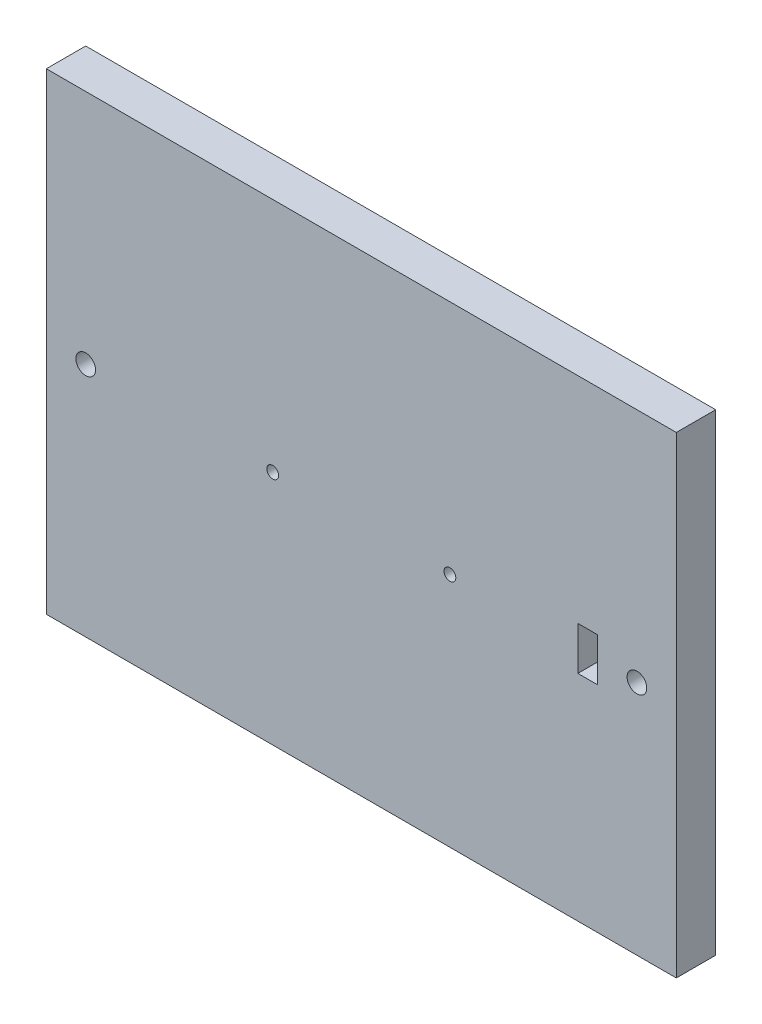
ISO-10303-21;
HEADER;
FILE_DESCRIPTION(('STEP AP214'),'2;1');
FILE_NAME('part.step','',(''),(''),'','','');
FILE_SCHEMA(('AUTOMOTIVE_DESIGN { 1 0 10303 214 1 1 1 1 }'));
ENDSEC;
DATA;
#1=APPLICATION_CONTEXT('core data for automotive mechanical design processes');
#2=APPLICATION_PROTOCOL_DEFINITION('international standard','automotive_design',2000,#1);
#3=PRODUCT_CONTEXT('',#1,'mechanical');
#4=PRODUCT('Part','Part','',(#3));
#5=PRODUCT_RELATED_PRODUCT_CATEGORY('part','',(#4));
#6=PRODUCT_DEFINITION_FORMATION('','',#4);
#7=PRODUCT_DEFINITION_CONTEXT('part definition',#1,'design');
#8=PRODUCT_DEFINITION('design','',#6,#7);
#9=PRODUCT_DEFINITION_SHAPE('','',#8);
#10=(LENGTH_UNIT() NAMED_UNIT(*) SI_UNIT(.MILLI.,.METRE.));
#11=(NAMED_UNIT(*) PLANE_ANGLE_UNIT() SI_UNIT($,.RADIAN.));
#12=(NAMED_UNIT(*) SI_UNIT($,.STERADIAN.) SOLID_ANGLE_UNIT());
#13=UNCERTAINTY_MEASURE_WITH_UNIT(LENGTH_MEASURE(1.E-05),#10,'distance_accuracy_value','');
#14=(GEOMETRIC_REPRESENTATION_CONTEXT(3) GLOBAL_UNCERTAINTY_ASSIGNED_CONTEXT((#13)) GLOBAL_UNIT_ASSIGNED_CONTEXT((#10,
#11,#12)) REPRESENTATION_CONTEXT('',''));
#15=CARTESIAN_POINT('',(0.,0.,0.));
#16=DIRECTION('',(0.,0.,1.));
#17=DIRECTION('',(1.,0.,0.));
#18=AXIS2_PLACEMENT_3D('',#15,#16,#17);
#19=CARTESIAN_POINT('',(0.,0.,0.));
#20=DIRECTION('',(0.,0.,1.));
#21=DIRECTION('',(1.,0.,0.));
#22=AXIS2_PLACEMENT_3D('',#19,#20,#21);
#23=PLANE('',#22);
#24=DIRECTION('',(1.,0.,0.));
#25=VECTOR('',#24,1.);
#26=CARTESIAN_POINT('',(-80.,-60.,0.));
#27=LINE('',#26,#25);
#28=CARTESIAN_POINT('',(-80.,-60.,0.));
#29=VERTEX_POINT('',#28);
#30=CARTESIAN_POINT('',(80.,-60.,0.));
#31=VERTEX_POINT('',#30);
#32=EDGE_CURVE('E436',#29,#31,#27,.T.);
#33=ORIENTED_EDGE('',*,*,#32,.F.);
#34=DIRECTION('',(0.,1.,0.));
#35=VECTOR('',#34,1.);
#36=CARTESIAN_POINT('',(-80.,-60.,0.));
#37=LINE('',#36,#35);
#38=CARTESIAN_POINT('',(-80.,60.,0.));
#39=VERTEX_POINT('',#38);
#40=EDGE_CURVE('E445',#29,#39,#37,.T.);
#41=ORIENTED_EDGE('',*,*,#40,.T.);
#42=DIRECTION('',(1.,0.,0.));
#43=VECTOR('',#42,1.);
#44=CARTESIAN_POINT('',(-80.,60.,0.));
#45=LINE('',#44,#43);
#46=CARTESIAN_POINT('',(80.,60.,0.));
#47=VERTEX_POINT('',#46);
#48=EDGE_CURVE('E464',#39,#47,#45,.T.);
#49=ORIENTED_EDGE('',*,*,#48,.T.);
#50=DIRECTION('',(0.,1.,0.));
#51=VECTOR('',#50,1.);
#52=CARTESIAN_POINT('',(80.,-60.,0.));
#53=LINE('',#52,#51);
#54=EDGE_CURVE('E460',#31,#47,#53,.T.);
#55=ORIENTED_EDGE('',*,*,#54,.F.);
#56=EDGE_LOOP('',(#33,#41,#49,#55));
#57=FACE_BOUND('',#56,.T.);
#58=CARTESIAN_POINT('',(22.5,0.,0.));
#59=DIRECTION('',(0.,0.,-1.));
#60=DIRECTION('',(-1.,0.,0.));
#61=AXIS2_PLACEMENT_3D('',#58,#59,#60);
#62=CIRCLE('',#61,1.5);
#63=CARTESIAN_POINT('',(21.,0.,0.));
#64=VERTEX_POINT('',#63);
#65=EDGE_CURVE('E374',#64,#64,#62,.T.);
#66=ORIENTED_EDGE('',*,*,#65,.F.);
#67=EDGE_LOOP('',(#66));
#68=FACE_BOUND('',#67,.T.);
#69=CARTESIAN_POINT('',(-22.5,0.,0.));
#70=DIRECTION('',(0.,0.,-1.));
#71=DIRECTION('',(-1.,0.,0.));
#72=AXIS2_PLACEMENT_3D('',#69,#70,#71);
#73=CIRCLE('',#72,1.5);
#74=CARTESIAN_POINT('',(-24.,0.,0.));
#75=VERTEX_POINT('',#74);
#76=EDGE_CURVE('E375',#75,#75,#73,.T.);
#77=ORIENTED_EDGE('',*,*,#76,.F.);
#78=EDGE_LOOP('',(#77));
#79=FACE_BOUND('',#78,.T.);
#80=DIRECTION('',(-1.,0.,0.));
#81=VECTOR('',#80,1.);
#82=CARTESIAN_POINT('',(55.,-5.5,0.));
#83=LINE('',#82,#81);
#84=CARTESIAN_POINT('',(60.,-5.50000000000001,0.));
#85=VERTEX_POINT('',#84);
#86=CARTESIAN_POINT('',(55.,-5.5,0.));
#87=VERTEX_POINT('',#86);
#88=EDGE_CURVE('E409',#85,#87,#83,.T.);
#89=ORIENTED_EDGE('',*,*,#88,.F.);
#90=DIRECTION('',(0.,-1.,0.));
#91=VECTOR('',#90,1.);
#92=CARTESIAN_POINT('',(60.,-5.50000000000001,0.));
#93=LINE('',#92,#91);
#94=CARTESIAN_POINT('',(60.,5.49999999999999,0.));
#95=VERTEX_POINT('',#94);
#96=EDGE_CURVE('E406',#95,#85,#93,.T.);
#97=ORIENTED_EDGE('',*,*,#96,.F.);
#98=DIRECTION('',(1.,0.,0.));
#99=VECTOR('',#98,1.);
#100=CARTESIAN_POINT('',(55.,5.49999999999999,0.));
#101=LINE('',#100,#99);
#102=CARTESIAN_POINT('',(55.,5.49999999999999,0.));
#103=VERTEX_POINT('',#102);
#104=EDGE_CURVE('E393',#103,#95,#101,.T.);
#105=ORIENTED_EDGE('',*,*,#104,.F.);
#106=DIRECTION('',(0.,1.,0.));
#107=VECTOR('',#106,1.);
#108=CARTESIAN_POINT('',(55.,-5.5,0.));
#109=LINE('',#108,#107);
#110=EDGE_CURVE('E414',#87,#103,#109,.T.);
#111=ORIENTED_EDGE('',*,*,#110,.F.);
#112=EDGE_LOOP('',(#89,#97,#105,#111));
#113=FACE_BOUND('',#112,.T.);
#114=DIRECTION('',(-1.,0.,0.));
#115=VECTOR('',#114,1.);
#116=CARTESIAN_POINT('',(-75.,-5.,0.));
#117=LINE('',#116,#115);
#118=CARTESIAN_POINT('',(-65.,-5.,0.));
#119=VERTEX_POINT('',#118);
#120=CARTESIAN_POINT('',(-75.,-5.,0.));
#121=VERTEX_POINT('',#120);
#122=EDGE_CURVE('E348',#119,#121,#117,.T.);
#123=ORIENTED_EDGE('',*,*,#122,.F.);
#124=DIRECTION('',(0.,-1.,0.));
#125=VECTOR('',#124,1.);
#126=CARTESIAN_POINT('',(-65.,-5.,0.));
#127=LINE('',#126,#125);
#128=CARTESIAN_POINT('',(-65.,5.,0.));
#129=VERTEX_POINT('',#128);
#130=EDGE_CURVE('E281',#129,#119,#127,.T.);
#131=ORIENTED_EDGE('',*,*,#130,.F.);
#132=DIRECTION('',(1.,0.,0.));
#133=VECTOR('',#132,1.);
#134=CARTESIAN_POINT('',(-75.,5.,0.));
#135=LINE('',#134,#133);
#136=CARTESIAN_POINT('',(-75.,5.,0.));
#137=VERTEX_POINT('',#136);
#138=EDGE_CURVE('E333',#137,#129,#135,.T.);
#139=ORIENTED_EDGE('',*,*,#138,.F.);
#140=DIRECTION('',(0.,1.,0.));
#141=VECTOR('',#140,1.);
#142=CARTESIAN_POINT('',(-75.,-5.,0.));
#143=LINE('',#142,#141);
#144=EDGE_CURVE('E352',#121,#137,#143,.T.);
#145=ORIENTED_EDGE('',*,*,#144,.F.);
#146=EDGE_LOOP('',(#123,#131,#139,#145));
#147=FACE_BOUND('',#146,.T.);
#148=DIRECTION('',(-1.,0.,0.));
#149=VECTOR('',#148,1.);
#150=CARTESIAN_POINT('',(65.,-5.,0.));
#151=LINE('',#150,#149);
#152=CARTESIAN_POINT('',(75.,-5.,0.));
#153=VERTEX_POINT('',#152);
#154=CARTESIAN_POINT('',(65.,-5.,0.));
#155=VERTEX_POINT('',#154);
#156=EDGE_CURVE('E303',#153,#155,#151,.T.);
#157=ORIENTED_EDGE('',*,*,#156,.F.);
#158=DIRECTION('',(0.,-1.,0.));
#159=VECTOR('',#158,1.);
#160=CARTESIAN_POINT('',(75.,-5.,0.));
#161=LINE('',#160,#159);
#162=CARTESIAN_POINT('',(75.,5.,0.));
#163=VERTEX_POINT('',#162);
#164=EDGE_CURVE('E300',#163,#153,#161,.T.);
#165=ORIENTED_EDGE('',*,*,#164,.F.);
#166=DIRECTION('',(1.,0.,0.));
#167=VECTOR('',#166,1.);
#168=CARTESIAN_POINT('',(65.,5.,0.));
#169=LINE('',#168,#167);
#170=CARTESIAN_POINT('',(65.,5.,0.));
#171=VERTEX_POINT('',#170);
#172=EDGE_CURVE('E287',#171,#163,#169,.T.);
#173=ORIENTED_EDGE('',*,*,#172,.F.);
#174=DIRECTION('',(0.,1.,0.));
#175=VECTOR('',#174,1.);
#176=CARTESIAN_POINT('',(65.,-5.,0.));
#177=LINE('',#176,#175);
#178=EDGE_CURVE('E308',#155,#171,#177,.T.);
#179=ORIENTED_EDGE('',*,*,#178,.F.);
#180=EDGE_LOOP('',(#157,#165,#173,#179));
#181=FACE_BOUND('',#180,.T.);
#182=DIRECTION('',(0.,-1.,0.));
#183=VECTOR('',#182,1.);
#184=CARTESIAN_POINT('',(45.,-14.,0.));
#185=LINE('',#184,#183);
#186=CARTESIAN_POINT('',(45.,-11.,0.));
#187=VERTEX_POINT('',#186);
#188=CARTESIAN_POINT('',(45.,-14.,0.));
#189=VERTEX_POINT('',#188);
#190=EDGE_CURVE('E232',#187,#189,#185,.T.);
#191=ORIENTED_EDGE('',*,*,#190,.F.);
#192=DIRECTION('',(1.,0.,0.));
#193=VECTOR('',#192,1.);
#194=CARTESIAN_POINT('',(-45.,-11.,0.));
#195=LINE('',#194,#193);
#196=CARTESIAN_POINT('',(-45.,-11.,0.));
#197=VERTEX_POINT('',#196);
#198=EDGE_CURVE('E242',#197,#187,#195,.T.);
#199=ORIENTED_EDGE('',*,*,#198,.F.);
#200=DIRECTION('',(0.,1.,0.));
#201=VECTOR('',#200,1.);
#202=CARTESIAN_POINT('',(-45.,-14.,0.));
#203=LINE('',#202,#201);
#204=CARTESIAN_POINT('',(-45.,-14.,0.));
#205=VERTEX_POINT('',#204);
#206=EDGE_CURVE('E259',#205,#197,#203,.T.);
#207=ORIENTED_EDGE('',*,*,#206,.F.);
#208=DIRECTION('',(-1.,0.,0.));
#209=VECTOR('',#208,1.);
#210=CARTESIAN_POINT('',(-45.,-14.,0.));
#211=LINE('',#210,#209);
#212=EDGE_CURVE('E255',#189,#205,#211,.T.);
#213=ORIENTED_EDGE('',*,*,#212,.F.);
#214=EDGE_LOOP('',(#191,#199,#207,#213));
#215=FACE_BOUND('',#214,.T.);
#216=ADVANCED_FACE('F39',(#57,#68,#79,#113,#147,#181,#215),#23,.F.);
#217=CARTESIAN_POINT('',(-70.,0.,10.));
#218=DIRECTION('',(0.,0.,-1.));
#219=DIRECTION('',(-1.,0.,0.));
#220=AXIS2_PLACEMENT_3D('',#217,#218,#219);
#221=CYLINDRICAL_SURFACE('',#220,2.5);
#222=CARTESIAN_POINT('',(-70.,0.,10.));
#223=DIRECTION('',(0.,0.,-1.));
#224=DIRECTION('',(-1.,0.,0.));
#225=AXIS2_PLACEMENT_3D('',#222,#223,#224);
#226=CIRCLE('',#225,2.5);
#227=CARTESIAN_POINT('',(-72.5,0.,10.));
#228=VERTEX_POINT('',#227);
#229=EDGE_CURVE('E379',#228,#228,#226,.T.);
#230=ORIENTED_EDGE('',*,*,#229,.F.);
#231=EDGE_LOOP('',(#230));
#232=FACE_BOUND('',#231,.T.);
#233=CARTESIAN_POINT('',(-70.,0.,4.));
#234=DIRECTION('',(0.,0.,-1.));
#235=DIRECTION('',(-1.,0.,0.));
#236=AXIS2_PLACEMENT_3D('',#233,#234,#235);
#237=CIRCLE('',#236,2.5);
#238=CARTESIAN_POINT('',(-72.5,0.,4.));
#239=VERTEX_POINT('',#238);
#240=EDGE_CURVE('E410',#239,#239,#237,.F.);
#241=ORIENTED_EDGE('',*,*,#240,.F.);
#242=EDGE_LOOP('',(#241));
#243=FACE_BOUND('',#242,.T.);
#244=ADVANCED_FACE('F514',(#232,#243),#221,.F.);
#245=CARTESIAN_POINT('',(70.,0.,10.));
#246=DIRECTION('',(0.,0.,-1.));
#247=DIRECTION('',(-1.,0.,0.));
#248=AXIS2_PLACEMENT_3D('',#245,#246,#247);
#249=CYLINDRICAL_SURFACE('',#248,2.5);
#250=CARTESIAN_POINT('',(70.,0.,10.));
#251=DIRECTION('',(0.,0.,-1.));
#252=DIRECTION('',(-1.,0.,0.));
#253=AXIS2_PLACEMENT_3D('',#250,#251,#252);
#254=CIRCLE('',#253,2.5);
#255=CARTESIAN_POINT('',(67.5,0.,10.));
#256=VERTEX_POINT('',#255);
#257=EDGE_CURVE('E383',#256,#256,#254,.T.);
#258=ORIENTED_EDGE('',*,*,#257,.F.);
#259=EDGE_LOOP('',(#258));
#260=FACE_BOUND('',#259,.T.);
#261=CARTESIAN_POINT('',(70.,0.,4.));
#262=DIRECTION('',(0.,0.,-1.));
#263=DIRECTION('',(-1.,0.,0.));
#264=AXIS2_PLACEMENT_3D('',#261,#262,#263);
#265=CIRCLE('',#264,2.5);
#266=CARTESIAN_POINT('',(67.5,0.,4.));
#267=VERTEX_POINT('',#266);
#268=EDGE_CURVE('E318',#267,#267,#265,.F.);
#269=ORIENTED_EDGE('',*,*,#268,.F.);
#270=EDGE_LOOP('',(#269));
#271=FACE_BOUND('',#270,.T.);
#272=ADVANCED_FACE('F520',(#260,#271),#249,.F.);
#273=CARTESIAN_POINT('',(-80.,-60.,10.));
#274=DIRECTION('',(0.,1.,0.));
#275=DIRECTION('',(0.,0.,1.));
#276=AXIS2_PLACEMENT_3D('',#273,#274,#275);
#277=PLANE('',#276);
#278=ORIENTED_EDGE('',*,*,#32,.T.);
#279=DIRECTION('',(0.,0.,-1.));
#280=VECTOR('',#279,1.);
#281=CARTESIAN_POINT('',(80.,-60.,10.));
#282=LINE('',#281,#280);
#283=CARTESIAN_POINT('',(80.,-60.,10.));
#284=VERTEX_POINT('',#283);
#285=EDGE_CURVE('E479',#284,#31,#282,.T.);
#286=ORIENTED_EDGE('',*,*,#285,.F.);
#287=DIRECTION('',(1.,0.,0.));
#288=VECTOR('',#287,1.);
#289=CARTESIAN_POINT('',(-80.,-60.,10.));
#290=LINE('',#289,#288);
#291=CARTESIAN_POINT('',(-80.,-60.,10.));
#292=VERTEX_POINT('',#291);
#293=EDGE_CURVE('E440',#292,#284,#290,.T.);
#294=ORIENTED_EDGE('',*,*,#293,.F.);
#295=DIRECTION('',(0.,0.,-1.));
#296=VECTOR('',#295,1.);
#297=CARTESIAN_POINT('',(-80.,-60.,10.));
#298=LINE('',#297,#296);
#299=EDGE_CURVE('E456',#292,#29,#298,.T.);
#300=ORIENTED_EDGE('',*,*,#299,.T.);
#301=EDGE_LOOP('',(#278,#286,#294,#300));
#302=FACE_BOUND('',#301,.T.);
#303=ADVANCED_FACE('F41',(#302),#277,.F.);
#304=CARTESIAN_POINT('',(80.,-60.,10.));
#305=DIRECTION('',(-1.,0.,0.));
#306=DIRECTION('',(0.,0.,1.));
#307=AXIS2_PLACEMENT_3D('',#304,#305,#306);
#308=PLANE('',#307);
#309=ORIENTED_EDGE('',*,*,#54,.T.);
#310=DIRECTION('',(0.,0.,-1.));
#311=VECTOR('',#310,1.);
#312=CARTESIAN_POINT('',(80.,60.,10.));
#313=LINE('',#312,#311);
#314=CARTESIAN_POINT('',(80.,60.,10.));
#315=VERTEX_POINT('',#314);
#316=EDGE_CURVE('E476',#315,#47,#313,.T.);
#317=ORIENTED_EDGE('',*,*,#316,.F.);
#318=DIRECTION('',(0.,1.,0.));
#319=VECTOR('',#318,1.);
#320=CARTESIAN_POINT('',(80.,-60.,10.));
#321=LINE('',#320,#319);
#322=EDGE_CURVE('E444',#284,#315,#321,.T.);
#323=ORIENTED_EDGE('',*,*,#322,.F.);
#324=ORIENTED_EDGE('',*,*,#285,.T.);
#325=EDGE_LOOP('',(#309,#317,#323,#324));
#326=FACE_BOUND('',#325,.T.);
#327=ADVANCED_FACE('F535',(#326),#308,.F.);
#328=CARTESIAN_POINT('',(-80.,60.,10.));
#329=DIRECTION('',(0.,1.,0.));
#330=DIRECTION('',(0.,0.,1.));
#331=AXIS2_PLACEMENT_3D('',#328,#329,#330);
#332=PLANE('',#331);
#333=ORIENTED_EDGE('',*,*,#48,.F.);
#334=DIRECTION('',(0.,0.,-1.));
#335=VECTOR('',#334,1.);
#336=CARTESIAN_POINT('',(-80.,60.,10.));
#337=LINE('',#336,#335);
#338=CARTESIAN_POINT('',(-80.,60.,10.));
#339=VERTEX_POINT('',#338);
#340=EDGE_CURVE('E473',#339,#39,#337,.T.);
#341=ORIENTED_EDGE('',*,*,#340,.F.);
#342=DIRECTION('',(1.,0.,0.));
#343=VECTOR('',#342,1.);
#344=CARTESIAN_POINT('',(-80.,60.,10.));
#345=LINE('',#344,#343);
#346=EDGE_CURVE('E448',#339,#315,#345,.T.);
#347=ORIENTED_EDGE('',*,*,#346,.T.);
#348=ORIENTED_EDGE('',*,*,#316,.T.);
#349=EDGE_LOOP('',(#333,#341,#347,#348));
#350=FACE_BOUND('',#349,.T.);
#351=ADVANCED_FACE('F532',(#350),#332,.T.);
#352=CARTESIAN_POINT('',(-80.,-60.,10.));
#353=DIRECTION('',(-1.,0.,0.));
#354=DIRECTION('',(0.,0.,1.));
#355=AXIS2_PLACEMENT_3D('',#352,#353,#354);
#356=PLANE('',#355);
#357=ORIENTED_EDGE('',*,*,#40,.F.);
#358=ORIENTED_EDGE('',*,*,#299,.F.);
#359=DIRECTION('',(0.,1.,0.));
#360=VECTOR('',#359,1.);
#361=CARTESIAN_POINT('',(-80.,-60.,10.));
#362=LINE('',#361,#360);
#363=EDGE_CURVE('E452',#292,#339,#362,.T.);
#364=ORIENTED_EDGE('',*,*,#363,.T.);
#365=ORIENTED_EDGE('',*,*,#340,.T.);
#366=EDGE_LOOP('',(#357,#358,#364,#365));
#367=FACE_BOUND('',#366,.T.);
#368=ADVANCED_FACE('F529',(#367),#356,.T.);
#369=CARTESIAN_POINT('',(0.,0.,10.));
#370=DIRECTION('',(0.,0.,1.));
#371=DIRECTION('',(1.,0.,0.));
#372=AXIS2_PLACEMENT_3D('',#369,#370,#371);
#373=PLANE('',#372);
#374=DIRECTION('',(0.,-1.,0.));
#375=VECTOR('',#374,1.);
#376=CARTESIAN_POINT('',(60.,-5.50000000000001,10.));
#377=LINE('',#376,#375);
#378=CARTESIAN_POINT('',(60.,5.49999999999999,10.));
#379=VERTEX_POINT('',#378);
#380=CARTESIAN_POINT('',(60.,-5.50000000000001,10.));
#381=VERTEX_POINT('',#380);
#382=EDGE_CURVE('E388',#379,#381,#377,.T.);
#383=ORIENTED_EDGE('',*,*,#382,.T.);
#384=DIRECTION('',(-1.,0.,0.));
#385=VECTOR('',#384,1.);
#386=CARTESIAN_POINT('',(55.,-5.5,10.));
#387=LINE('',#386,#385);
#388=CARTESIAN_POINT('',(55.,-5.5,10.));
#389=VERTEX_POINT('',#388);
#390=EDGE_CURVE('E392',#381,#389,#387,.T.);
#391=ORIENTED_EDGE('',*,*,#390,.T.);
#392=DIRECTION('',(0.,1.,0.));
#393=VECTOR('',#392,1.);
#394=CARTESIAN_POINT('',(55.,-5.5,10.));
#395=LINE('',#394,#393);
#396=CARTESIAN_POINT('',(55.,5.49999999999999,10.));
#397=VERTEX_POINT('',#396);
#398=EDGE_CURVE('E397',#389,#397,#395,.T.);
#399=ORIENTED_EDGE('',*,*,#398,.T.);
#400=DIRECTION('',(1.,0.,0.));
#401=VECTOR('',#400,1.);
#402=CARTESIAN_POINT('',(55.,5.49999999999999,10.));
#403=LINE('',#402,#401);
#404=EDGE_CURVE('E401',#397,#379,#403,.T.);
#405=ORIENTED_EDGE('',*,*,#404,.T.);
#406=EDGE_LOOP('',(#383,#391,#399,#405));
#407=FACE_BOUND('',#406,.T.);
#408=ORIENTED_EDGE('',*,*,#257,.T.);
#409=EDGE_LOOP('',(#408));
#410=FACE_BOUND('',#409,.T.);
#411=ORIENTED_EDGE('',*,*,#229,.T.);
#412=EDGE_LOOP('',(#411));
#413=FACE_BOUND('',#412,.T.);
#414=CARTESIAN_POINT('',(-22.5,0.,10.));
#415=DIRECTION('',(0.,0.,-1.));
#416=DIRECTION('',(-1.,0.,0.));
#417=AXIS2_PLACEMENT_3D('',#414,#415,#416);
#418=CIRCLE('',#417,1.5);
#419=CARTESIAN_POINT('',(-24.,0.,10.));
#420=VERTEX_POINT('',#419);
#421=EDGE_CURVE('E370',#420,#420,#418,.T.);
#422=ORIENTED_EDGE('',*,*,#421,.T.);
#423=EDGE_LOOP('',(#422));
#424=FACE_BOUND('',#423,.T.);
#425=CARTESIAN_POINT('',(22.5,0.,10.));
#426=DIRECTION('',(0.,0.,-1.));
#427=DIRECTION('',(-1.,0.,0.));
#428=AXIS2_PLACEMENT_3D('',#425,#426,#427);
#429=CIRCLE('',#428,1.5);
#430=CARTESIAN_POINT('',(21.,0.,10.));
#431=VERTEX_POINT('',#430);
#432=EDGE_CURVE('E432',#431,#431,#429,.T.);
#433=ORIENTED_EDGE('',*,*,#432,.T.);
#434=EDGE_LOOP('',(#433));
#435=FACE_BOUND('',#434,.T.);
#436=ORIENTED_EDGE('',*,*,#293,.T.);
#437=ORIENTED_EDGE('',*,*,#322,.T.);
#438=ORIENTED_EDGE('',*,*,#346,.F.);
#439=ORIENTED_EDGE('',*,*,#363,.F.);
#440=EDGE_LOOP('',(#436,#437,#438,#439));
#441=FACE_BOUND('',#440,.T.);
#442=ADVANCED_FACE('F527',(#407,#410,#413,#424,#435,#441),#373,.T.);
#443=CARTESIAN_POINT('',(22.5,0.,10.));
#444=DIRECTION('',(0.,0.,-1.));
#445=DIRECTION('',(-1.,0.,0.));
#446=AXIS2_PLACEMENT_3D('',#443,#444,#445);
#447=CYLINDRICAL_SURFACE('',#446,1.5);
#448=ORIENTED_EDGE('',*,*,#432,.F.);
#449=EDGE_LOOP('',(#448));
#450=FACE_BOUND('',#449,.T.);
#451=ORIENTED_EDGE('',*,*,#65,.T.);
#452=EDGE_LOOP('',(#451));
#453=FACE_BOUND('',#452,.T.);
#454=ADVANCED_FACE('F552',(#450,#453),#447,.F.);
#455=CARTESIAN_POINT('',(-22.5,0.,10.));
#456=DIRECTION('',(0.,0.,-1.));
#457=DIRECTION('',(-1.,0.,0.));
#458=AXIS2_PLACEMENT_3D('',#455,#456,#457);
#459=CYLINDRICAL_SURFACE('',#458,1.5);
#460=ORIENTED_EDGE('',*,*,#421,.F.);
#461=EDGE_LOOP('',(#460));
#462=FACE_BOUND('',#461,.T.);
#463=ORIENTED_EDGE('',*,*,#76,.T.);
#464=EDGE_LOOP('',(#463));
#465=FACE_BOUND('',#464,.T.);
#466=ADVANCED_FACE('F557',(#462,#465),#459,.F.);
#467=CARTESIAN_POINT('',(60.,-5.50000000000001,10.));
#468=DIRECTION('',(1.,0.,0.));
#469=DIRECTION('',(0.,0.,-1.));
#470=AXIS2_PLACEMENT_3D('',#467,#468,#469);
#471=PLANE('',#470);
#472=ORIENTED_EDGE('',*,*,#96,.T.);
#473=DIRECTION('',(0.,0.,-1.));
#474=VECTOR('',#473,1.);
#475=CARTESIAN_POINT('',(60.,-5.50000000000001,10.));
#476=LINE('',#475,#474);
#477=EDGE_CURVE('E405',#381,#85,#476,.T.);
#478=ORIENTED_EDGE('',*,*,#477,.F.);
#479=ORIENTED_EDGE('',*,*,#382,.F.);
#480=DIRECTION('',(0.,0.,-1.));
#481=VECTOR('',#480,1.);
#482=CARTESIAN_POINT('',(60.,5.49999999999999,10.));
#483=LINE('',#482,#481);
#484=EDGE_CURVE('E387',#379,#95,#483,.T.);
#485=ORIENTED_EDGE('',*,*,#484,.T.);
#486=EDGE_LOOP('',(#472,#478,#479,#485));
#487=FACE_BOUND('',#486,.T.);
#488=ADVANCED_FACE('F648',(#487),#471,.F.);
#489=CARTESIAN_POINT('',(55.,5.49999999999999,10.));
#490=DIRECTION('',(0.,1.,0.));
#491=DIRECTION('',(-1.,0.,0.));
#492=AXIS2_PLACEMENT_3D('',#489,#490,#491);
#493=PLANE('',#492);
#494=ORIENTED_EDGE('',*,*,#104,.T.);
#495=ORIENTED_EDGE('',*,*,#484,.F.);
#496=ORIENTED_EDGE('',*,*,#404,.F.);
#497=DIRECTION('',(0.,0.,-1.));
#498=VECTOR('',#497,1.);
#499=CARTESIAN_POINT('',(55.,5.49999999999999,10.));
#500=LINE('',#499,#498);
#501=EDGE_CURVE('E423',#397,#103,#500,.T.);
#502=ORIENTED_EDGE('',*,*,#501,.T.);
#503=EDGE_LOOP('',(#494,#495,#496,#502));
#504=FACE_BOUND('',#503,.T.);
#505=ADVANCED_FACE('F654',(#504),#493,.F.);
#506=CARTESIAN_POINT('',(55.,-5.5,10.));
#507=DIRECTION('',(-1.,0.,0.));
#508=DIRECTION('',(0.,0.,1.));
#509=AXIS2_PLACEMENT_3D('',#506,#507,#508);
#510=PLANE('',#509);
#511=ORIENTED_EDGE('',*,*,#110,.T.);
#512=ORIENTED_EDGE('',*,*,#501,.F.);
#513=ORIENTED_EDGE('',*,*,#398,.F.);
#514=DIRECTION('',(0.,0.,-1.));
#515=VECTOR('',#514,1.);
#516=CARTESIAN_POINT('',(55.,-5.5,10.));
#517=LINE('',#516,#515);
#518=EDGE_CURVE('E426',#389,#87,#517,.T.);
#519=ORIENTED_EDGE('',*,*,#518,.T.);
#520=EDGE_LOOP('',(#511,#512,#513,#519));
#521=FACE_BOUND('',#520,.T.);
#522=ADVANCED_FACE('F657',(#521),#510,.F.);
#523=CARTESIAN_POINT('',(55.,-5.5,10.));
#524=DIRECTION('',(0.,-1.,0.));
#525=DIRECTION('',(1.,0.,0.));
#526=AXIS2_PLACEMENT_3D('',#523,#524,#525);
#527=PLANE('',#526);
#528=ORIENTED_EDGE('',*,*,#88,.T.);
#529=ORIENTED_EDGE('',*,*,#518,.F.);
#530=ORIENTED_EDGE('',*,*,#390,.F.);
#531=ORIENTED_EDGE('',*,*,#477,.T.);
#532=EDGE_LOOP('',(#528,#529,#530,#531));
#533=FACE_BOUND('',#532,.T.);
#534=ADVANCED_FACE('F611',(#533),#527,.F.);
#535=CARTESIAN_POINT('',(0.,0.,4.));
#536=DIRECTION('',(0.,0.,-1.));
#537=DIRECTION('',(-1.,0.,0.));
#538=AXIS2_PLACEMENT_3D('',#535,#536,#537);
#539=PLANE('',#538);
#540=DIRECTION('',(0.,-1.,0.));
#541=VECTOR('',#540,1.);
#542=CARTESIAN_POINT('',(75.,-5.,4.));
#543=LINE('',#542,#541);
#544=CARTESIAN_POINT('',(75.,5.,4.));
#545=VERTEX_POINT('',#544);
#546=CARTESIAN_POINT('',(75.,-5.,4.));
#547=VERTEX_POINT('',#546);
#548=EDGE_CURVE('E282',#545,#547,#543,.T.);
#549=ORIENTED_EDGE('',*,*,#548,.T.);
#550=DIRECTION('',(-1.,0.,0.));
#551=VECTOR('',#550,1.);
#552=CARTESIAN_POINT('',(65.,-5.,4.));
#553=LINE('',#552,#551);
#554=CARTESIAN_POINT('',(65.,-5.,4.));
#555=VERTEX_POINT('',#554);
#556=EDGE_CURVE('E286',#547,#555,#553,.T.);
#557=ORIENTED_EDGE('',*,*,#556,.T.);
#558=DIRECTION('',(0.,1.,0.));
#559=VECTOR('',#558,1.);
#560=CARTESIAN_POINT('',(65.,-5.,4.));
#561=LINE('',#560,#559);
#562=CARTESIAN_POINT('',(65.,5.,4.));
#563=VERTEX_POINT('',#562);
#564=EDGE_CURVE('E291',#555,#563,#561,.T.);
#565=ORIENTED_EDGE('',*,*,#564,.T.);
#566=DIRECTION('',(1.,0.,0.));
#567=VECTOR('',#566,1.);
#568=CARTESIAN_POINT('',(65.,5.,4.));
#569=LINE('',#568,#567);
#570=EDGE_CURVE('E295',#563,#545,#569,.T.);
#571=ORIENTED_EDGE('',*,*,#570,.T.);
#572=EDGE_LOOP('',(#549,#557,#565,#571));
#573=FACE_BOUND('',#572,.T.);
#574=ORIENTED_EDGE('',*,*,#268,.T.);
#575=EDGE_LOOP('',(#574));
#576=FACE_BOUND('',#575,.T.);
#577=ADVANCED_FACE('F607',(#573,#576),#539,.T.);
#578=CARTESIAN_POINT('',(75.,-5.,4.));
#579=DIRECTION('',(1.,0.,0.));
#580=DIRECTION('',(0.,0.,-1.));
#581=AXIS2_PLACEMENT_3D('',#578,#579,#580);
#582=PLANE('',#581);
#583=ORIENTED_EDGE('',*,*,#164,.T.);
#584=DIRECTION('',(0.,0.,-1.));
#585=VECTOR('',#584,1.);
#586=CARTESIAN_POINT('',(75.,-5.,4.));
#587=LINE('',#586,#585);
#588=EDGE_CURVE('E299',#547,#153,#587,.T.);
#589=ORIENTED_EDGE('',*,*,#588,.F.);
#590=ORIENTED_EDGE('',*,*,#548,.F.);
#591=DIRECTION('',(0.,0.,-1.));
#592=VECTOR('',#591,1.);
#593=CARTESIAN_POINT('',(75.,5.,4.));
#594=LINE('',#593,#592);
#595=EDGE_CURVE('E315',#545,#163,#594,.T.);
#596=ORIENTED_EDGE('',*,*,#595,.T.);
#597=EDGE_LOOP('',(#583,#589,#590,#596));
#598=FACE_BOUND('',#597,.T.);
#599=ADVANCED_FACE('F610',(#598),#582,.F.);
#600=CARTESIAN_POINT('',(65.,5.,4.));
#601=DIRECTION('',(0.,1.,0.));
#602=DIRECTION('',(0.,0.,1.));
#603=AXIS2_PLACEMENT_3D('',#600,#601,#602);
#604=PLANE('',#603);
#605=ORIENTED_EDGE('',*,*,#172,.T.);
#606=ORIENTED_EDGE('',*,*,#595,.F.);
#607=ORIENTED_EDGE('',*,*,#570,.F.);
#608=DIRECTION('',(0.,0.,-1.));
#609=VECTOR('',#608,1.);
#610=CARTESIAN_POINT('',(65.,5.,4.));
#611=LINE('',#610,#609);
#612=EDGE_CURVE('E319',#563,#171,#611,.T.);
#613=ORIENTED_EDGE('',*,*,#612,.T.);
#614=EDGE_LOOP('',(#605,#606,#607,#613));
#615=FACE_BOUND('',#614,.T.);
#616=ADVANCED_FACE('F613',(#615),#604,.F.);
#617=CARTESIAN_POINT('',(65.,-5.,4.));
#618=DIRECTION('',(-1.,0.,0.));
#619=DIRECTION('',(0.,0.,1.));
#620=AXIS2_PLACEMENT_3D('',#617,#618,#619);
#621=PLANE('',#620);
#622=ORIENTED_EDGE('',*,*,#178,.T.);
#623=ORIENTED_EDGE('',*,*,#612,.F.);
#624=ORIENTED_EDGE('',*,*,#564,.F.);
#625=DIRECTION('',(0.,0.,-1.));
#626=VECTOR('',#625,1.);
#627=CARTESIAN_POINT('',(65.,-5.,4.));
#628=LINE('',#627,#626);
#629=EDGE_CURVE('E322',#555,#155,#628,.T.);
#630=ORIENTED_EDGE('',*,*,#629,.T.);
#631=EDGE_LOOP('',(#622,#623,#624,#630));
#632=FACE_BOUND('',#631,.T.);
#633=ADVANCED_FACE('F616',(#632),#621,.F.);
#634=CARTESIAN_POINT('',(65.,-5.,4.));
#635=DIRECTION('',(0.,-1.,0.));
#636=DIRECTION('',(0.,0.,-1.));
#637=AXIS2_PLACEMENT_3D('',#634,#635,#636);
#638=PLANE('',#637);
#639=ORIENTED_EDGE('',*,*,#156,.T.);
#640=ORIENTED_EDGE('',*,*,#629,.F.);
#641=ORIENTED_EDGE('',*,*,#556,.F.);
#642=ORIENTED_EDGE('',*,*,#588,.T.);
#643=EDGE_LOOP('',(#639,#640,#641,#642));
#644=FACE_BOUND('',#643,.T.);
#645=ADVANCED_FACE('F620',(#644),#638,.F.);
#646=CARTESIAN_POINT('',(0.,0.,4.));
#647=DIRECTION('',(0.,0.,-1.));
#648=DIRECTION('',(-1.,0.,0.));
#649=AXIS2_PLACEMENT_3D('',#646,#647,#648);
#650=PLANE('',#649);
#651=DIRECTION('',(0.,-1.,0.));
#652=VECTOR('',#651,1.);
#653=CARTESIAN_POINT('',(-65.,-5.,4.));
#654=LINE('',#653,#652);
#655=CARTESIAN_POINT('',(-65.,5.,4.));
#656=VERTEX_POINT('',#655);
#657=CARTESIAN_POINT('',(-65.,-5.,4.));
#658=VERTEX_POINT('',#657);
#659=EDGE_CURVE('E328',#656,#658,#654,.T.);
#660=ORIENTED_EDGE('',*,*,#659,.T.);
#661=DIRECTION('',(-1.,0.,0.));
#662=VECTOR('',#661,1.);
#663=CARTESIAN_POINT('',(-75.,-5.,4.));
#664=LINE('',#663,#662);
#665=CARTESIAN_POINT('',(-75.,-5.,4.));
#666=VERTEX_POINT('',#665);
#667=EDGE_CURVE('E332',#658,#666,#664,.T.);
#668=ORIENTED_EDGE('',*,*,#667,.T.);
#669=DIRECTION('',(0.,1.,0.));
#670=VECTOR('',#669,1.);
#671=CARTESIAN_POINT('',(-75.,-5.,4.));
#672=LINE('',#671,#670);
#673=CARTESIAN_POINT('',(-75.,5.,4.));
#674=VERTEX_POINT('',#673);
#675=EDGE_CURVE('E337',#666,#674,#672,.T.);
#676=ORIENTED_EDGE('',*,*,#675,.T.);
#677=DIRECTION('',(1.,0.,0.));
#678=VECTOR('',#677,1.);
#679=CARTESIAN_POINT('',(-75.,5.,4.));
#680=LINE('',#679,#678);
#681=EDGE_CURVE('E341',#674,#656,#680,.T.);
#682=ORIENTED_EDGE('',*,*,#681,.T.);
#683=EDGE_LOOP('',(#660,#668,#676,#682));
#684=FACE_BOUND('',#683,.T.);
#685=ORIENTED_EDGE('',*,*,#240,.T.);
#686=EDGE_LOOP('',(#685));
#687=FACE_BOUND('',#686,.T.);
#688=ADVANCED_FACE('F624',(#684,#687),#650,.T.);
#689=CARTESIAN_POINT('',(-65.,-5.,4.));
#690=DIRECTION('',(1.,0.,0.));
#691=DIRECTION('',(0.,0.,-1.));
#692=AXIS2_PLACEMENT_3D('',#689,#690,#691);
#693=PLANE('',#692);
#694=ORIENTED_EDGE('',*,*,#130,.T.);
#695=DIRECTION('',(0.,0.,-1.));
#696=VECTOR('',#695,1.);
#697=CARTESIAN_POINT('',(-65.,-5.,4.));
#698=LINE('',#697,#696);
#699=EDGE_CURVE('E345',#658,#119,#698,.T.);
#700=ORIENTED_EDGE('',*,*,#699,.F.);
#701=ORIENTED_EDGE('',*,*,#659,.F.);
#702=DIRECTION('',(0.,0.,-1.));
#703=VECTOR('',#702,1.);
#704=CARTESIAN_POINT('',(-65.,5.,4.));
#705=LINE('',#704,#703);
#706=EDGE_CURVE('E304',#656,#129,#705,.T.);
#707=ORIENTED_EDGE('',*,*,#706,.T.);
#708=EDGE_LOOP('',(#694,#700,#701,#707));
#709=FACE_BOUND('',#708,.T.);
#710=ADVANCED_FACE('F631',(#709),#693,.F.);
#711=CARTESIAN_POINT('',(-75.,5.,4.));
#712=DIRECTION('',(0.,1.,0.));
#713=DIRECTION('',(0.,0.,1.));
#714=AXIS2_PLACEMENT_3D('',#711,#712,#713);
#715=PLANE('',#714);
#716=ORIENTED_EDGE('',*,*,#138,.T.);
#717=ORIENTED_EDGE('',*,*,#706,.F.);
#718=ORIENTED_EDGE('',*,*,#681,.F.);
#719=DIRECTION('',(0.,0.,-1.));
#720=VECTOR('',#719,1.);
#721=CARTESIAN_POINT('',(-75.,5.,4.));
#722=LINE('',#721,#720);
#723=EDGE_CURVE('E361',#674,#137,#722,.T.);
#724=ORIENTED_EDGE('',*,*,#723,.T.);
#725=EDGE_LOOP('',(#716,#717,#718,#724));
#726=FACE_BOUND('',#725,.T.);
#727=ADVANCED_FACE('F633',(#726),#715,.F.);
#728=CARTESIAN_POINT('',(-75.,-5.,4.));
#729=DIRECTION('',(-1.,0.,0.));
#730=DIRECTION('',(0.,0.,1.));
#731=AXIS2_PLACEMENT_3D('',#728,#729,#730);
#732=PLANE('',#731);
#733=ORIENTED_EDGE('',*,*,#144,.T.);
#734=ORIENTED_EDGE('',*,*,#723,.F.);
#735=ORIENTED_EDGE('',*,*,#675,.F.);
#736=DIRECTION('',(0.,0.,-1.));
#737=VECTOR('',#736,1.);
#738=CARTESIAN_POINT('',(-75.,-5.,4.));
#739=LINE('',#738,#737);
#740=EDGE_CURVE('E364',#666,#121,#739,.T.);
#741=ORIENTED_EDGE('',*,*,#740,.T.);
#742=EDGE_LOOP('',(#733,#734,#735,#741));
#743=FACE_BOUND('',#742,.T.);
#744=ADVANCED_FACE('F636',(#743),#732,.F.);
#745=CARTESIAN_POINT('',(-75.,-5.,4.));
#746=DIRECTION('',(0.,-1.,0.));
#747=DIRECTION('',(0.,0.,-1.));
#748=AXIS2_PLACEMENT_3D('',#745,#746,#747);
#749=PLANE('',#748);
#750=ORIENTED_EDGE('',*,*,#122,.T.);
#751=ORIENTED_EDGE('',*,*,#740,.F.);
#752=ORIENTED_EDGE('',*,*,#667,.F.);
#753=ORIENTED_EDGE('',*,*,#699,.T.);
#754=EDGE_LOOP('',(#750,#751,#752,#753));
#755=FACE_BOUND('',#754,.T.);
#756=ADVANCED_FACE('F603',(#755),#749,.F.);
#757=CARTESIAN_POINT('',(45.,-14.,-25.05));
#758=DIRECTION('',(-1.,0.,0.));
#759=DIRECTION('',(0.,0.,1.));
#760=AXIS2_PLACEMENT_3D('',#757,#758,#759);
#761=PLANE('',#760);
#762=ORIENTED_EDGE('',*,*,#190,.T.);
#763=DIRECTION('',(0.,0.,1.));
#764=VECTOR('',#763,1.);
#765=CARTESIAN_POINT('',(45.,-14.,-25.05));
#766=LINE('',#765,#764);
#767=CARTESIAN_POINT('',(45.,-14.,-25.05));
#768=VERTEX_POINT('',#767);
#769=EDGE_CURVE('E277',#768,#189,#766,.T.);
#770=ORIENTED_EDGE('',*,*,#769,.F.);
#771=DIRECTION('',(0.,-1.,0.));
#772=VECTOR('',#771,1.);
#773=CARTESIAN_POINT('',(45.,-14.,-25.05));
#774=LINE('',#773,#772);
#775=CARTESIAN_POINT('',(45.,-11.,-25.05));
#776=VERTEX_POINT('',#775);
#777=EDGE_CURVE('E237',#776,#768,#774,.T.);
#778=ORIENTED_EDGE('',*,*,#777,.F.);
#779=DIRECTION('',(0.,0.,1.));
#780=VECTOR('',#779,1.);
#781=CARTESIAN_POINT('',(45.,-11.,-25.05));
#782=LINE('',#781,#780);
#783=EDGE_CURVE('E251',#776,#187,#782,.T.);
#784=ORIENTED_EDGE('',*,*,#783,.T.);
#785=EDGE_LOOP('',(#762,#770,#778,#784));
#786=FACE_BOUND('',#785,.T.);
#787=ADVANCED_FACE('F591',(#786),#761,.F.);
#788=CARTESIAN_POINT('',(-45.,-14.,-25.05));
#789=DIRECTION('',(0.,1.,0.));
#790=DIRECTION('',(0.,0.,1.));
#791=AXIS2_PLACEMENT_3D('',#788,#789,#790);
#792=PLANE('',#791);
#793=DIRECTION('',(0.,0.,-1.));
#794=VECTOR('',#793,1.);
#795=CARTESIAN_POINT('',(-3.2,-14.,-19.325));
#796=LINE('',#795,#794);
#797=CARTESIAN_POINT('',(-3.19999999999999,-14.,-5.725));
#798=VERTEX_POINT('',#797);
#799=CARTESIAN_POINT('',(-3.2,-14.,-19.325));
#800=VERTEX_POINT('',#799);
#801=EDGE_CURVE('E214',#798,#800,#796,.T.);
#802=ORIENTED_EDGE('',*,*,#801,.F.);
#803=CARTESIAN_POINT('',(0.,-14.,-5.725));
#804=DIRECTION('',(0.,-1.,0.));
#805=DIRECTION('',(0.,0.,-1.));
#806=AXIS2_PLACEMENT_3D('',#803,#804,#805);
#807=CIRCLE('',#806,3.2);
#808=CARTESIAN_POINT('',(3.2,-14.,-5.725));
#809=VERTEX_POINT('',#808);
#810=EDGE_CURVE('E55',#809,#798,#807,.T.);
#811=ORIENTED_EDGE('',*,*,#810,.F.);
#812=DIRECTION('',(0.,0.,1.));
#813=VECTOR('',#812,1.);
#814=CARTESIAN_POINT('',(3.2,-14.,-19.325));
#815=LINE('',#814,#813);
#816=CARTESIAN_POINT('',(3.2,-14.,-19.325));
#817=VERTEX_POINT('',#816);
#818=EDGE_CURVE('E222',#817,#809,#815,.T.);
#819=ORIENTED_EDGE('',*,*,#818,.F.);
#820=CARTESIAN_POINT('',(0.,-14.,-19.325));
#821=DIRECTION('',(0.,-1.,0.));
#822=DIRECTION('',(0.,0.,1.));
#823=AXIS2_PLACEMENT_3D('',#820,#821,#822);
#824=CIRCLE('',#823,3.2);
#825=EDGE_CURVE('E204',#800,#817,#824,.T.);
#826=ORIENTED_EDGE('',*,*,#825,.F.);
#827=EDGE_LOOP('',(#802,#811,#819,#826));
#828=FACE_BOUND('',#827,.T.);
#829=ORIENTED_EDGE('',*,*,#212,.T.);
#830=DIRECTION('',(0.,0.,1.));
#831=VECTOR('',#830,1.);
#832=CARTESIAN_POINT('',(-45.,-14.,-25.05));
#833=LINE('',#832,#831);
#834=CARTESIAN_POINT('',(-45.,-14.,-25.05));
#835=VERTEX_POINT('',#834);
#836=EDGE_CURVE('E273',#835,#205,#833,.T.);
#837=ORIENTED_EDGE('',*,*,#836,.F.);
#838=DIRECTION('',(-1.,0.,0.));
#839=VECTOR('',#838,1.);
#840=CARTESIAN_POINT('',(-45.,-14.,-25.05));
#841=LINE('',#840,#839);
#842=EDGE_CURVE('E241',#768,#835,#841,.T.);
#843=ORIENTED_EDGE('',*,*,#842,.F.);
#844=ORIENTED_EDGE('',*,*,#769,.T.);
#845=EDGE_LOOP('',(#829,#837,#843,#844));
#846=FACE_BOUND('',#845,.T.);
#847=ADVANCED_FACE('F219',(#828,#846),#792,.F.);
#848=CARTESIAN_POINT('',(-45.,-14.,-25.05));
#849=DIRECTION('',(1.,0.,0.));
#850=DIRECTION('',(0.,0.,-1.));
#851=AXIS2_PLACEMENT_3D('',#848,#849,#850);
#852=PLANE('',#851);
#853=ORIENTED_EDGE('',*,*,#206,.T.);
#854=DIRECTION('',(0.,0.,1.));
#855=VECTOR('',#854,1.);
#856=CARTESIAN_POINT('',(-45.,-11.,-25.05));
#857=LINE('',#856,#855);
#858=CARTESIAN_POINT('',(-45.,-11.,-25.05));
#859=VERTEX_POINT('',#858);
#860=EDGE_CURVE('E269',#859,#197,#857,.T.);
#861=ORIENTED_EDGE('',*,*,#860,.F.);
#862=DIRECTION('',(0.,1.,0.));
#863=VECTOR('',#862,1.);
#864=CARTESIAN_POINT('',(-45.,-14.,-25.05));
#865=LINE('',#864,#863);
#866=EDGE_CURVE('E245',#835,#859,#865,.T.);
#867=ORIENTED_EDGE('',*,*,#866,.F.);
#868=ORIENTED_EDGE('',*,*,#836,.T.);
#869=EDGE_LOOP('',(#853,#861,#867,#868));
#870=FACE_BOUND('',#869,.T.);
#871=ADVANCED_FACE('F595',(#870),#852,.F.);
#872=CARTESIAN_POINT('',(-45.,-11.,-25.05));
#873=DIRECTION('',(0.,-1.,0.));
#874=DIRECTION('',(0.,0.,-1.));
#875=AXIS2_PLACEMENT_3D('',#872,#873,#874);
#876=PLANE('',#875);
#877=DIRECTION('',(0.,0.,1.));
#878=VECTOR('',#877,1.);
#879=CARTESIAN_POINT('',(3.2,-11.,-25.05));
#880=LINE('',#879,#878);
#881=CARTESIAN_POINT('',(3.2,-11.,-19.325));
#882=VERTEX_POINT('',#881);
#883=CARTESIAN_POINT('',(3.2,-11.,-5.725));
#884=VERTEX_POINT('',#883);
#885=EDGE_CURVE('E48',#882,#884,#880,.T.);
#886=ORIENTED_EDGE('',*,*,#885,.T.);
#887=CARTESIAN_POINT('',(0.,-11.,-5.725));
#888=DIRECTION('',(0.,-1.,0.));
#889=DIRECTION('',(0.,0.,-1.));
#890=AXIS2_PLACEMENT_3D('',#887,#888,#889);
#891=CIRCLE('',#890,3.2);
#892=CARTESIAN_POINT('',(-3.2,-11.,-5.725));
#893=VERTEX_POINT('',#892);
#894=EDGE_CURVE('E11',#884,#893,#891,.T.);
#895=ORIENTED_EDGE('',*,*,#894,.T.);
#896=DIRECTION('',(0.,0.,-1.));
#897=VECTOR('',#896,1.);
#898=CARTESIAN_POINT('',(-3.19999999999999,-11.,-25.05));
#899=LINE('',#898,#897);
#900=CARTESIAN_POINT('',(-3.19999999999999,-11.,-19.325));
#901=VERTEX_POINT('',#900);
#902=EDGE_CURVE('E483',#893,#901,#899,.T.);
#903=ORIENTED_EDGE('',*,*,#902,.T.);
#904=CARTESIAN_POINT('',(0.,-11.,-19.325));
#905=DIRECTION('',(0.,-1.,0.));
#906=DIRECTION('',(0.,0.,-1.));
#907=AXIS2_PLACEMENT_3D('',#904,#905,#906);
#908=CIRCLE('',#907,3.2);
#909=EDGE_CURVE('E207',#901,#882,#908,.T.);
#910=ORIENTED_EDGE('',*,*,#909,.T.);
#911=EDGE_LOOP('',(#886,#895,#903,#910));
#912=FACE_BOUND('',#911,.T.);
#913=ORIENTED_EDGE('',*,*,#198,.T.);
#914=ORIENTED_EDGE('',*,*,#783,.F.);
#915=DIRECTION('',(1.,0.,0.));
#916=VECTOR('',#915,1.);
#917=CARTESIAN_POINT('',(-45.,-11.,-25.05));
#918=LINE('',#917,#916);
#919=EDGE_CURVE('E248',#859,#776,#918,.T.);
#920=ORIENTED_EDGE('',*,*,#919,.F.);
#921=ORIENTED_EDGE('',*,*,#860,.T.);
#922=EDGE_LOOP('',(#913,#914,#920,#921));
#923=FACE_BOUND('',#922,.T.);
#924=ADVANCED_FACE('F496',(#912,#923),#876,.F.);
#925=CARTESIAN_POINT('',(0.,0.,-25.05));
#926=DIRECTION('',(0.,0.,-1.));
#927=DIRECTION('',(-1.,0.,0.));
#928=AXIS2_PLACEMENT_3D('',#925,#926,#927);
#929=PLANE('',#928);
#930=ORIENTED_EDGE('',*,*,#777,.T.);
#931=ORIENTED_EDGE('',*,*,#842,.T.);
#932=ORIENTED_EDGE('',*,*,#866,.T.);
#933=ORIENTED_EDGE('',*,*,#919,.T.);
#934=EDGE_LOOP('',(#930,#931,#932,#933));
#935=FACE_BOUND('',#934,.T.);
#936=ADVANCED_FACE('F503',(#935),#929,.T.);
#937=CARTESIAN_POINT('',(0.,60.,-5.725));
#938=DIRECTION('',(0.,-1.,0.));
#939=DIRECTION('',(0.,0.,-1.));
#940=AXIS2_PLACEMENT_3D('',#937,#938,#939);
#941=CYLINDRICAL_SURFACE('',#940,3.2);
#942=DIRECTION('',(0.,-1.,0.));
#943=VECTOR('',#942,1.);
#944=CARTESIAN_POINT('',(3.2,60.,-5.725));
#945=LINE('',#944,#943);
#946=EDGE_CURVE('E229',#884,#809,#945,.T.);
#947=ORIENTED_EDGE('',*,*,#946,.T.);
#948=ORIENTED_EDGE('',*,*,#810,.T.);
#949=DIRECTION('',(0.,-1.,0.));
#950=VECTOR('',#949,1.);
#951=CARTESIAN_POINT('',(-3.2,60.,-5.725));
#952=LINE('',#951,#950);
#953=EDGE_CURVE('E211',#893,#798,#952,.T.);
#954=ORIENTED_EDGE('',*,*,#953,.F.);
#955=ORIENTED_EDGE('',*,*,#894,.F.);
#956=EDGE_LOOP('',(#947,#948,#954,#955));
#957=FACE_BOUND('',#956,.T.);
#958=ADVANCED_FACE('F501',(#957),#941,.F.);
#959=CARTESIAN_POINT('',(3.2,60.,-19.325));
#960=DIRECTION('',(1.,0.,0.));
#961=DIRECTION('',(0.,0.,-1.));
#962=AXIS2_PLACEMENT_3D('',#959,#960,#961);
#963=PLANE('',#962);
#964=DIRECTION('',(0.,-1.,0.));
#965=VECTOR('',#964,1.);
#966=CARTESIAN_POINT('',(3.2,60.,-19.325));
#967=LINE('',#966,#965);
#968=EDGE_CURVE('E210',#882,#817,#967,.T.);
#969=ORIENTED_EDGE('',*,*,#968,.T.);
#970=ORIENTED_EDGE('',*,*,#818,.T.);
#971=ORIENTED_EDGE('',*,*,#946,.F.);
#972=ORIENTED_EDGE('',*,*,#885,.F.);
#973=EDGE_LOOP('',(#969,#970,#971,#972));
#974=FACE_BOUND('',#973,.T.);
#975=ADVANCED_FACE('F500',(#974),#963,.F.);
#976=CARTESIAN_POINT('',(0.,60.,-19.325));
#977=DIRECTION('',(0.,-1.,0.));
#978=DIRECTION('',(0.,0.,-1.));
#979=AXIS2_PLACEMENT_3D('',#976,#977,#978);
#980=CYLINDRICAL_SURFACE('',#979,3.2);
#981=DIRECTION('',(0.,-1.,0.));
#982=VECTOR('',#981,1.);
#983=CARTESIAN_POINT('',(-3.2,60.,-19.325));
#984=LINE('',#983,#982);
#985=EDGE_CURVE('E63',#901,#800,#984,.T.);
#986=ORIENTED_EDGE('',*,*,#985,.T.);
#987=ORIENTED_EDGE('',*,*,#825,.T.);
#988=ORIENTED_EDGE('',*,*,#968,.F.);
#989=ORIENTED_EDGE('',*,*,#909,.F.);
#990=EDGE_LOOP('',(#986,#987,#988,#989));
#991=FACE_BOUND('',#990,.T.);
#992=ADVANCED_FACE('F201',(#991),#980,.F.);
#993=CARTESIAN_POINT('',(-3.2,60.,-19.325));
#994=DIRECTION('',(-1.,0.,0.));
#995=DIRECTION('',(0.,0.,1.));
#996=AXIS2_PLACEMENT_3D('',#993,#994,#995);
#997=PLANE('',#996);
#998=ORIENTED_EDGE('',*,*,#953,.T.);
#999=ORIENTED_EDGE('',*,*,#801,.T.);
#1000=ORIENTED_EDGE('',*,*,#985,.F.);
#1001=ORIENTED_EDGE('',*,*,#902,.F.);
#1002=EDGE_LOOP('',(#998,#999,#1000,#1001));
#1003=FACE_BOUND('',#1002,.T.);
#1004=ADVANCED_FACE('F215',(#1003),#997,.F.);
#1005=CLOSED_SHELL('',(#216,#244,#272,#303,#327,#351,#368,#442,#454,#466,#488,#505,#522,#534,
#577,#599,#616,#633,#645,#688,#710,#727,#744,#756,#787,#847,#871,#924,#936,#958,#975,#992,#1004));
#1006=MANIFOLD_SOLID_BREP('B2',#1005);
#1007=ADVANCED_BREP_SHAPE_REPRESENTATION('',(#18,#1006),#14);
#1008=SHAPE_DEFINITION_REPRESENTATION(#9,#1007);
ENDSEC;
END-ISO-10303-21;
